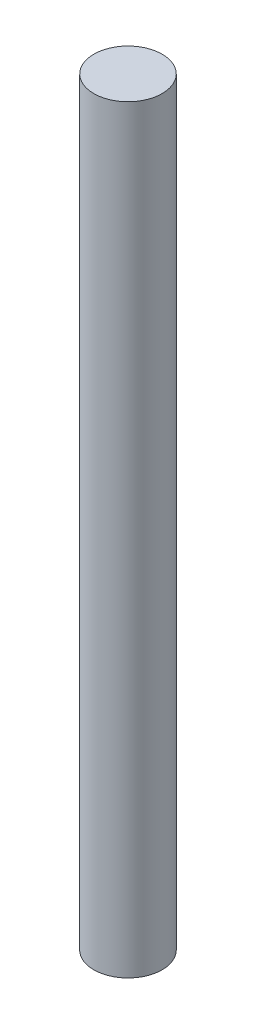
ISO-10303-21;
HEADER;
FILE_DESCRIPTION(('STEP AP214'),'2;1');
FILE_NAME('part.step','',(''),(''),'','','');
FILE_SCHEMA(('AUTOMOTIVE_DESIGN { 1 0 10303 214 1 1 1 1 }'));
ENDSEC;
DATA;
#1=APPLICATION_CONTEXT('core data for automotive mechanical design processes');
#2=APPLICATION_PROTOCOL_DEFINITION('international standard','automotive_design',2000,#1);
#3=PRODUCT_CONTEXT('',#1,'mechanical');
#4=PRODUCT('Part','Part','',(#3));
#5=PRODUCT_RELATED_PRODUCT_CATEGORY('part','',(#4));
#6=PRODUCT_DEFINITION_FORMATION('','',#4);
#7=PRODUCT_DEFINITION_CONTEXT('part definition',#1,'design');
#8=PRODUCT_DEFINITION('design','',#6,#7);
#9=PRODUCT_DEFINITION_SHAPE('','',#8);
#10=(LENGTH_UNIT() NAMED_UNIT(*) SI_UNIT(.MILLI.,.METRE.));
#11=(NAMED_UNIT(*) PLANE_ANGLE_UNIT() SI_UNIT($,.RADIAN.));
#12=(NAMED_UNIT(*) SI_UNIT($,.STERADIAN.) SOLID_ANGLE_UNIT());
#13=UNCERTAINTY_MEASURE_WITH_UNIT(LENGTH_MEASURE(1.E-05),#10,'distance_accuracy_value','');
#14=(GEOMETRIC_REPRESENTATION_CONTEXT(3) GLOBAL_UNCERTAINTY_ASSIGNED_CONTEXT((#13)) GLOBAL_UNIT_ASSIGNED_CONTEXT((#10,
#11,#12)) REPRESENTATION_CONTEXT('',''));
#15=CARTESIAN_POINT('',(0.,0.,0.));
#16=DIRECTION('',(0.,0.,1.));
#17=DIRECTION('',(1.,0.,0.));
#18=AXIS2_PLACEMENT_3D('',#15,#16,#17);
#19=CARTESIAN_POINT('',(0.,50.,0.));
#20=DIRECTION('',(0.,-1.,0.));
#21=DIRECTION('',(0.,0.,-1.));
#22=AXIS2_PLACEMENT_3D('',#19,#20,#21);
#23=CYLINDRICAL_SURFACE('',#22,2.25);
#24=CARTESIAN_POINT('',(0.,50.,0.));
#25=DIRECTION('',(0.,1.,0.));
#26=DIRECTION('',(0.,0.,1.));
#27=AXIS2_PLACEMENT_3D('',#24,#25,#26);
#28=CIRCLE('',#27,2.25);
#29=CARTESIAN_POINT('',(0.,50.,2.25));
#30=VERTEX_POINT('',#29);
#31=EDGE_CURVE('E10',#30,#30,#28,.T.);
#32=ORIENTED_EDGE('',*,*,#31,.F.);
#33=EDGE_LOOP('',(#32));
#34=FACE_BOUND('',#33,.T.);
#35=CARTESIAN_POINT('',(0.,0.,0.));
#36=DIRECTION('',(0.,1.,0.));
#37=DIRECTION('',(0.,0.,1.));
#38=AXIS2_PLACEMENT_3D('',#35,#36,#37);
#39=CIRCLE('',#38,2.25);
#40=CARTESIAN_POINT('',(0.,0.,2.25));
#41=VERTEX_POINT('',#40);
#42=EDGE_CURVE('E40',#41,#41,#39,.T.);
#43=ORIENTED_EDGE('',*,*,#42,.T.);
#44=EDGE_LOOP('',(#43));
#45=FACE_BOUND('',#44,.T.);
#46=ADVANCED_FACE('F37',(#34,#45),#23,.T.);
#47=CARTESIAN_POINT('',(0.,50.,0.));
#48=DIRECTION('',(0.,1.,0.));
#49=DIRECTION('',(0.,0.,1.));
#50=AXIS2_PLACEMENT_3D('',#47,#48,#49);
#51=PLANE('',#50);
#52=ORIENTED_EDGE('',*,*,#31,.T.);
#53=EDGE_LOOP('',(#52));
#54=FACE_BOUND('',#53,.T.);
#55=ADVANCED_FACE('F54',(#54),#51,.T.);
#56=CARTESIAN_POINT('',(0.,0.,0.));
#57=DIRECTION('',(0.,1.,0.));
#58=DIRECTION('',(0.,0.,1.));
#59=AXIS2_PLACEMENT_3D('',#56,#57,#58);
#60=PLANE('',#59);
#61=ORIENTED_EDGE('',*,*,#42,.F.);
#62=EDGE_LOOP('',(#61));
#63=FACE_BOUND('',#62,.T.);
#64=ADVANCED_FACE('F52',(#63),#60,.F.);
#65=CLOSED_SHELL('',(#46,#55,#64));
#66=MANIFOLD_SOLID_BREP('B2',#65);
#67=ADVANCED_BREP_SHAPE_REPRESENTATION('',(#18,#66),#14);
#68=SHAPE_DEFINITION_REPRESENTATION(#9,#67);
ENDSEC;
END-ISO-10303-21;
